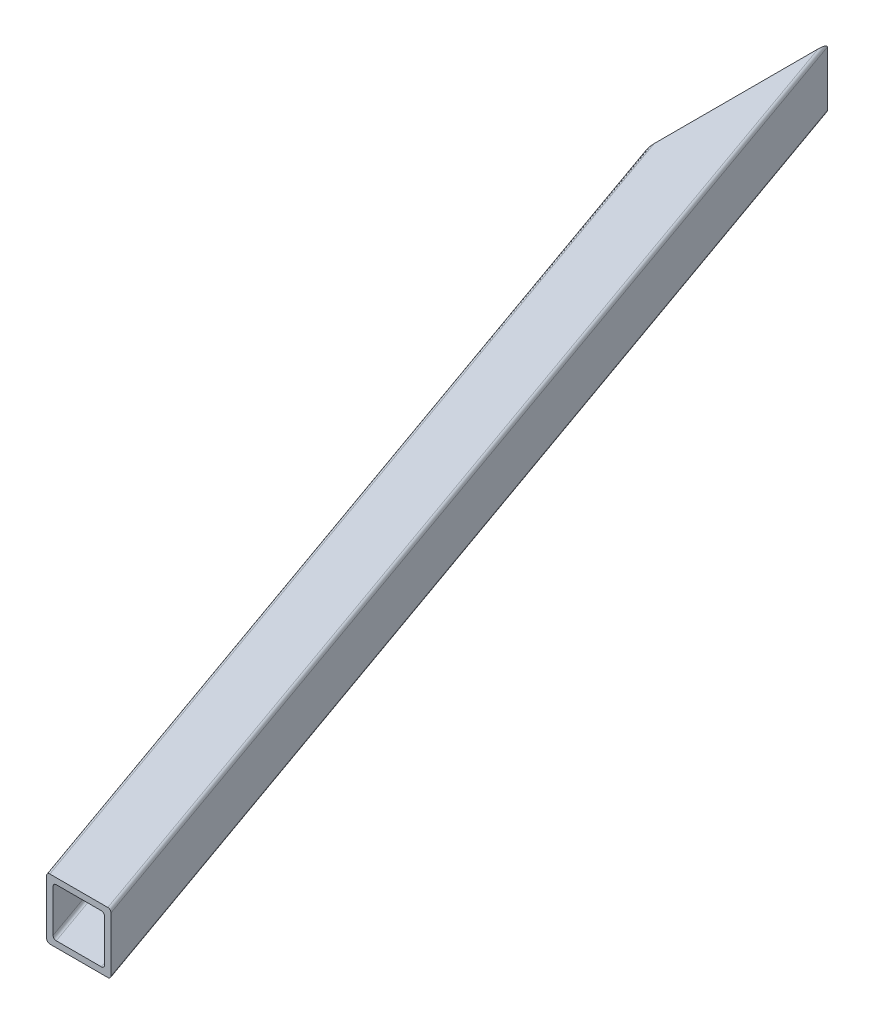
ISO-10303-21;
HEADER;
FILE_DESCRIPTION(('STEP AP214'),'2;1');
FILE_NAME('part.step','',(''),(''),'','','');
FILE_SCHEMA(('AUTOMOTIVE_DESIGN { 1 0 10303 214 1 1 1 1 }'));
ENDSEC;
DATA;
#1=APPLICATION_CONTEXT('core data for automotive mechanical design processes');
#2=APPLICATION_PROTOCOL_DEFINITION('international standard','automotive_design',2000,#1);
#3=PRODUCT_CONTEXT('',#1,'mechanical');
#4=PRODUCT('Part','Part','',(#3));
#5=PRODUCT_RELATED_PRODUCT_CATEGORY('part','',(#4));
#6=PRODUCT_DEFINITION_FORMATION('','',#4);
#7=PRODUCT_DEFINITION_CONTEXT('part definition',#1,'design');
#8=PRODUCT_DEFINITION('design','',#6,#7);
#9=PRODUCT_DEFINITION_SHAPE('','',#8);
#10=(LENGTH_UNIT() NAMED_UNIT(*) SI_UNIT(.MILLI.,.METRE.));
#11=(NAMED_UNIT(*) PLANE_ANGLE_UNIT() SI_UNIT($,.RADIAN.));
#12=(NAMED_UNIT(*) SI_UNIT($,.STERADIAN.) SOLID_ANGLE_UNIT());
#13=UNCERTAINTY_MEASURE_WITH_UNIT(LENGTH_MEASURE(1.E-05),#10,'distance_accuracy_value','');
#14=(GEOMETRIC_REPRESENTATION_CONTEXT(3) GLOBAL_UNCERTAINTY_ASSIGNED_CONTEXT((#13)) GLOBAL_UNIT_ASSIGNED_CONTEXT((#10,
#11,#12)) REPRESENTATION_CONTEXT('',''));
#15=CARTESIAN_POINT('',(0.,0.,0.));
#16=DIRECTION('',(0.,0.,1.));
#17=DIRECTION('',(1.,0.,0.));
#18=AXIS2_PLACEMENT_3D('',#15,#16,#17);
#19=CARTESIAN_POINT('',(0.,40.,-609.961146445834));
#20=DIRECTION('',(1.,0.,0.));
#21=DIRECTION('',(0.,0.,-1.));
#22=AXIS2_PLACEMENT_3D('',#19,#20,#21);
#23=PLANE('',#22);
#24=DIRECTION('',(0.,0.,-1.));
#25=VECTOR('',#24,1.);
#26=CARTESIAN_POINT('',(0.,4.,-609.961146445834));
#27=LINE('',#26,#25);
#28=CARTESIAN_POINT('',(0.,4.,-627.966974478959));
#29=VERTEX_POINT('',#28);
#30=CARTESIAN_POINT('',(0.,3.99999999999999,-711.994171966875));
#31=VERTEX_POINT('',#30);
#32=EDGE_CURVE('E254',#29,#31,#27,.T.);
#33=ORIENTED_EDGE('',*,*,#32,.T.);
#34=CARTESIAN_POINT('',(0.,6.,-711.994171966875));
#35=DIRECTION('',(1.,0.,0.));
#36=DIRECTION('',(0.,0.,-1.));
#37=AXIS2_PLACEMENT_3D('',#34,#35,#36);
#38=ELLIPSE('',#37,6.00194267770828,2.);
#39=CARTESIAN_POINT('',(0.,6.,-717.996114644584));
#40=VERTEX_POINT('',#39);
#41=EDGE_CURVE('E43',#31,#40,#38,.T.);
#42=ORIENTED_EDGE('',*,*,#41,.T.);
#43=DIRECTION('',(0.,1.,0.));
#44=VECTOR('',#43,1.);
#45=CARTESIAN_POINT('',(0.,40.,-717.996114644584));
#46=LINE('',#45,#44);
#47=CARTESIAN_POINT('',(0.,34.,-717.996114644584));
#48=VERTEX_POINT('',#47);
#49=EDGE_CURVE('E252',#40,#48,#46,.T.);
#50=ORIENTED_EDGE('',*,*,#49,.T.);
#51=CARTESIAN_POINT('',(0.,34.,-711.994171966875));
#52=DIRECTION('',(1.,0.,0.));
#53=DIRECTION('',(0.,0.,1.));
#54=AXIS2_PLACEMENT_3D('',#51,#52,#53);
#55=ELLIPSE('',#54,6.00194267770828,2.);
#56=CARTESIAN_POINT('',(0.,36.,-711.994171966875));
#57=VERTEX_POINT('',#56);
#58=EDGE_CURVE('E237',#48,#57,#55,.T.);
#59=ORIENTED_EDGE('',*,*,#58,.T.);
#60=DIRECTION('',(0.,0.,1.));
#61=VECTOR('',#60,1.);
#62=CARTESIAN_POINT('',(0.,36.,-609.961146445834));
#63=LINE('',#62,#61);
#64=CARTESIAN_POINT('',(0.,36.,-627.966974478959));
#65=VERTEX_POINT('',#64);
#66=EDGE_CURVE('E179',#57,#65,#63,.T.);
#67=ORIENTED_EDGE('',*,*,#66,.T.);
#68=CARTESIAN_POINT('',(0.,34.,-627.966974478959));
#69=DIRECTION('',(1.,0.,0.));
#70=DIRECTION('',(0.,0.,-1.));
#71=AXIS2_PLACEMENT_3D('',#68,#69,#70);
#72=ELLIPSE('',#71,6.00194267770827,2.);
#73=CARTESIAN_POINT('',(0.,34.,-621.965031801251));
#74=VERTEX_POINT('',#73);
#75=EDGE_CURVE('E243',#65,#74,#72,.T.);
#76=ORIENTED_EDGE('',*,*,#75,.T.);
#77=DIRECTION('',(0.,-1.,0.));
#78=VECTOR('',#77,1.);
#79=CARTESIAN_POINT('',(0.,40.,-621.965031801251));
#80=LINE('',#79,#78);
#81=CARTESIAN_POINT('',(0.,6.,-621.965031801251));
#82=VERTEX_POINT('',#81);
#83=EDGE_CURVE('E277',#74,#82,#80,.T.);
#84=ORIENTED_EDGE('',*,*,#83,.T.);
#85=CARTESIAN_POINT('',(0.,6.,-627.966974478959));
#86=DIRECTION('',(1.,0.,0.));
#87=DIRECTION('',(0.,0.,1.));
#88=AXIS2_PLACEMENT_3D('',#85,#86,#87);
#89=ELLIPSE('',#88,6.00194267770827,2.);
#90=EDGE_CURVE('E247',#82,#29,#89,.T.);
#91=ORIENTED_EDGE('',*,*,#90,.T.);
#92=EDGE_LOOP('',(#33,#42,#50,#59,#67,#76,#84,#91));
#93=FACE_BOUND('',#92,.T.);
#94=DIRECTION('',(0.,-1.,0.));
#95=VECTOR('',#94,1.);
#96=CARTESIAN_POINT('',(0.,40.,-609.961146445834));
#97=LINE('',#96,#95);
#98=CARTESIAN_POINT('',(0.,38.,-609.961146445834));
#99=VERTEX_POINT('',#98);
#100=CARTESIAN_POINT('',(0.,2.,-609.961146445834));
#101=VERTEX_POINT('',#100);
#102=EDGE_CURVE('E167',#99,#101,#97,.T.);
#103=ORIENTED_EDGE('',*,*,#102,.F.);
#104=CARTESIAN_POINT('',(0.,38.,-615.963089123543));
#105=DIRECTION('',(1.,0.,0.));
#106=DIRECTION('',(0.,0.,1.));
#107=AXIS2_PLACEMENT_3D('',#104,#105,#106);
#108=ELLIPSE('',#107,6.00194267770827,2.);
#109=CARTESIAN_POINT('',(0.,40.,-615.963089123543));
#110=VERTEX_POINT('',#109);
#111=EDGE_CURVE('E154',#99,#110,#108,.F.);
#112=ORIENTED_EDGE('',*,*,#111,.T.);
#113=DIRECTION('',(0.,0.,1.));
#114=VECTOR('',#113,1.);
#115=CARTESIAN_POINT('',(0.,40.,-609.961146445834));
#116=LINE('',#115,#114);
#117=CARTESIAN_POINT('',(0.,40.,-723.998057322292));
#118=VERTEX_POINT('',#117);
#119=EDGE_CURVE('E162',#118,#110,#116,.T.);
#120=ORIENTED_EDGE('',*,*,#119,.F.);
#121=CARTESIAN_POINT('',(0.,38.,-723.998057322292));
#122=DIRECTION('',(1.,0.,0.));
#123=DIRECTION('',(0.,0.,-1.));
#124=AXIS2_PLACEMENT_3D('',#121,#122,#123);
#125=ELLIPSE('',#124,6.00194267770828,2.);
#126=CARTESIAN_POINT('',(0.,38.,-730.));
#127=VERTEX_POINT('',#126);
#128=EDGE_CURVE('E58',#118,#127,#125,.F.);
#129=ORIENTED_EDGE('',*,*,#128,.T.);
#130=DIRECTION('',(0.,-1.,0.));
#131=VECTOR('',#130,1.);
#132=CARTESIAN_POINT('',(0.,40.,-730.));
#133=LINE('',#132,#131);
#134=CARTESIAN_POINT('',(0.,2.,-730.));
#135=VERTEX_POINT('',#134);
#136=EDGE_CURVE('E173',#127,#135,#133,.T.);
#137=ORIENTED_EDGE('',*,*,#136,.T.);
#138=CARTESIAN_POINT('',(0.,2.,-723.998057322292));
#139=DIRECTION('',(1.,0.,0.));
#140=DIRECTION('',(0.,0.,1.));
#141=AXIS2_PLACEMENT_3D('',#138,#139,#140);
#142=ELLIPSE('',#141,6.00194267770828,2.);
#143=CARTESIAN_POINT('',(0.,0.,-723.998057322292));
#144=VERTEX_POINT('',#143);
#145=EDGE_CURVE('E50',#135,#144,#142,.F.);
#146=ORIENTED_EDGE('',*,*,#145,.T.);
#147=DIRECTION('',(0.,0.,1.));
#148=VECTOR('',#147,1.);
#149=CARTESIAN_POINT('',(0.,0.,-609.961146445834));
#150=LINE('',#149,#148);
#151=CARTESIAN_POINT('',(0.,0.,-615.963089123543));
#152=VERTEX_POINT('',#151);
#153=EDGE_CURVE('E176',#144,#152,#150,.T.);
#154=ORIENTED_EDGE('',*,*,#153,.T.);
#155=CARTESIAN_POINT('',(0.,2.,-615.963089123543));
#156=DIRECTION('',(1.,0.,0.));
#157=DIRECTION('',(0.,0.,-1.));
#158=AXIS2_PLACEMENT_3D('',#155,#156,#157);
#159=ELLIPSE('',#158,6.00194267770827,2.);
#160=EDGE_CURVE('E155',#152,#101,#159,.F.);
#161=ORIENTED_EDGE('',*,*,#160,.T.);
#162=EDGE_LOOP('',(#103,#112,#120,#129,#137,#146,#154,#161));
#163=FACE_BOUND('',#162,.T.);
#164=ADVANCED_FACE('F35',(#93,#163),#23,.F.);
#165=CARTESIAN_POINT('',(0.,40.,-609.961146445834));
#166=DIRECTION('',(0.942847180080519,0.,-0.333225441727088));
#167=DIRECTION('',(-0.333225441727088,0.,-0.942847180080519));
#168=AXIS2_PLACEMENT_3D('',#165,#166,#167);
#169=PLANE('',#168);
#170=DIRECTION('',(0.,-1.,0.));
#171=VECTOR('',#170,1.);
#172=CARTESIAN_POINT('',(215.575309291816,40.,0.));
#173=LINE('',#172,#171);
#174=CARTESIAN_POINT('',(215.575309291816,38.,0.));
#175=VERTEX_POINT('',#174);
#176=CARTESIAN_POINT('',(215.575309291816,2.,0.));
#177=VERTEX_POINT('',#176);
#178=EDGE_CURVE('E188',#175,#177,#173,.T.);
#179=ORIENTED_EDGE('',*,*,#178,.F.);
#180=DIRECTION('',(0.333225441727088,0.,0.942847180080519));
#181=VECTOR('',#180,1.);
#182=CARTESIAN_POINT('',(0.,38.,-609.961146445834));
#183=LINE('',#182,#181);
#184=EDGE_CURVE('E205',#175,#99,#183,.F.);
#185=ORIENTED_EDGE('',*,*,#184,.T.);
#186=ORIENTED_EDGE('',*,*,#102,.T.);
#187=DIRECTION('',(0.333225441727088,0.,0.942847180080519));
#188=VECTOR('',#187,1.);
#189=CARTESIAN_POINT('',(215.575309291816,2.,0.));
#190=LINE('',#189,#188);
#191=EDGE_CURVE('E202',#101,#177,#190,.T.);
#192=ORIENTED_EDGE('',*,*,#191,.T.);
#193=EDGE_LOOP('',(#179,#185,#186,#192));
#194=FACE_BOUND('',#193,.T.);
#195=ADVANCED_FACE('F316',(#194),#169,.F.);
#196=CARTESIAN_POINT('',(215.575309291816,40.,0.));
#197=DIRECTION('',(0.,0.,-1.));
#198=DIRECTION('',(-1.,0.,0.));
#199=AXIS2_PLACEMENT_3D('',#196,#197,#198);
#200=PLANE('',#199);
#201=DIRECTION('',(-1.,0.,0.));
#202=VECTOR('',#201,1.);
#203=CARTESIAN_POINT('',(215.575309291816,4.,0.));
#204=LINE('',#203,#202);
#205=CARTESIAN_POINT('',(251.636296393772,3.99999999999999,0.));
#206=VERTEX_POINT('',#205);
#207=CARTESIAN_POINT('',(221.939012898043,4.,0.));
#208=VERTEX_POINT('',#207);
#209=EDGE_CURVE('E273',#206,#208,#204,.T.);
#210=ORIENTED_EDGE('',*,*,#209,.T.);
#211=CARTESIAN_POINT('',(221.939012898043,6.,0.));
#212=DIRECTION('',(0.,0.,-1.));
#213=DIRECTION('',(1.,0.,0.));
#214=AXIS2_PLACEMENT_3D('',#211,#212,#213);
#215=ELLIPSE('',#214,2.12123453540923,2.);
#216=CARTESIAN_POINT('',(219.817778362634,6.,0.));
#217=VERTEX_POINT('',#216);
#218=EDGE_CURVE('E245',#208,#217,#215,.T.);
#219=ORIENTED_EDGE('',*,*,#218,.T.);
#220=DIRECTION('',(0.,1.,0.));
#221=VECTOR('',#220,1.);
#222=CARTESIAN_POINT('',(219.817778362634,40.,0.));
#223=LINE('',#222,#221);
#224=CARTESIAN_POINT('',(219.817778362634,34.,0.));
#225=VERTEX_POINT('',#224);
#226=EDGE_CURVE('E263',#217,#225,#223,.T.);
#227=ORIENTED_EDGE('',*,*,#226,.T.);
#228=CARTESIAN_POINT('',(221.939012898043,34.,0.));
#229=DIRECTION('',(0.,0.,-1.));
#230=DIRECTION('',(-1.,0.,0.));
#231=AXIS2_PLACEMENT_3D('',#228,#229,#230);
#232=ELLIPSE('',#231,2.12123453540923,2.);
#233=CARTESIAN_POINT('',(221.939012898043,36.,0.));
#234=VERTEX_POINT('',#233);
#235=EDGE_CURVE('E241',#225,#234,#232,.T.);
#236=ORIENTED_EDGE('',*,*,#235,.T.);
#237=DIRECTION('',(1.,0.,0.));
#238=VECTOR('',#237,1.);
#239=CARTESIAN_POINT('',(215.575309291816,36.,0.));
#240=LINE('',#239,#238);
#241=CARTESIAN_POINT('',(251.636296393772,36.,0.));
#242=VERTEX_POINT('',#241);
#243=EDGE_CURVE('E279',#234,#242,#240,.T.);
#244=ORIENTED_EDGE('',*,*,#243,.T.);
#245=CARTESIAN_POINT('',(251.636296393772,34.,0.));
#246=DIRECTION('',(0.,0.,-1.));
#247=DIRECTION('',(1.,0.,0.));
#248=AXIS2_PLACEMENT_3D('',#245,#246,#247);
#249=ELLIPSE('',#248,2.12123453540923,2.);
#250=CARTESIAN_POINT('',(253.757530929182,34.,0.));
#251=VERTEX_POINT('',#250);
#252=EDGE_CURVE('E239',#242,#251,#249,.T.);
#253=ORIENTED_EDGE('',*,*,#252,.T.);
#254=DIRECTION('',(0.,-1.,0.));
#255=VECTOR('',#254,1.);
#256=CARTESIAN_POINT('',(253.757530929182,40.,0.));
#257=LINE('',#256,#255);
#258=CARTESIAN_POINT('',(253.757530929182,6.,0.));
#259=VERTEX_POINT('',#258);
#260=EDGE_CURVE('E264',#251,#259,#257,.T.);
#261=ORIENTED_EDGE('',*,*,#260,.T.);
#262=CARTESIAN_POINT('',(251.636296393772,6.,0.));
#263=DIRECTION('',(0.,0.,-1.));
#264=DIRECTION('',(-1.,0.,0.));
#265=AXIS2_PLACEMENT_3D('',#262,#263,#264);
#266=ELLIPSE('',#265,2.12123453540923,2.);
#267=EDGE_CURVE('E11',#259,#206,#266,.T.);
#268=ORIENTED_EDGE('',*,*,#267,.T.);
#269=EDGE_LOOP('',(#210,#219,#227,#236,#244,#253,#261,#268));
#270=FACE_BOUND('',#269,.T.);
#271=DIRECTION('',(1.,0.,0.));
#272=VECTOR('',#271,1.);
#273=CARTESIAN_POINT('',(215.575309291816,40.,0.));
#274=LINE('',#273,#272);
#275=CARTESIAN_POINT('',(217.696543827225,40.,0.));
#276=VERTEX_POINT('',#275);
#277=CARTESIAN_POINT('',(255.878765464591,40.,0.));
#278=VERTEX_POINT('',#277);
#279=EDGE_CURVE('E165',#276,#278,#274,.T.);
#280=ORIENTED_EDGE('',*,*,#279,.F.);
#281=CARTESIAN_POINT('',(217.696543827225,38.,0.));
#282=DIRECTION('',(0.,0.,-1.));
#283=DIRECTION('',(1.,0.,0.));
#284=AXIS2_PLACEMENT_3D('',#281,#282,#283);
#285=ELLIPSE('',#284,2.12123453540923,2.);
#286=EDGE_CURVE('E200',#276,#175,#285,.F.);
#287=ORIENTED_EDGE('',*,*,#286,.T.);
#288=ORIENTED_EDGE('',*,*,#178,.T.);
#289=CARTESIAN_POINT('',(217.696543827225,2.,0.));
#290=DIRECTION('',(0.,0.,-1.));
#291=DIRECTION('',(-1.,0.,0.));
#292=AXIS2_PLACEMENT_3D('',#289,#290,#291);
#293=ELLIPSE('',#292,2.12123453540923,2.);
#294=CARTESIAN_POINT('',(217.696543827225,0.,0.));
#295=VERTEX_POINT('',#294);
#296=EDGE_CURVE('E196',#177,#295,#293,.F.);
#297=ORIENTED_EDGE('',*,*,#296,.T.);
#298=DIRECTION('',(1.,0.,0.));
#299=VECTOR('',#298,1.);
#300=CARTESIAN_POINT('',(215.575309291816,0.,0.));
#301=LINE('',#300,#299);
#302=CARTESIAN_POINT('',(255.878765464591,0.,0.));
#303=VERTEX_POINT('',#302);
#304=EDGE_CURVE('E171',#295,#303,#301,.T.);
#305=ORIENTED_EDGE('',*,*,#304,.T.);
#306=CARTESIAN_POINT('',(255.878765464591,2.,0.));
#307=DIRECTION('',(0.,0.,-1.));
#308=DIRECTION('',(1.,0.,0.));
#309=AXIS2_PLACEMENT_3D('',#306,#307,#308);
#310=ELLIPSE('',#309,2.12123453540923,2.);
#311=CARTESIAN_POINT('',(258.,2.,0.));
#312=VERTEX_POINT('',#311);
#313=EDGE_CURVE('E194',#303,#312,#310,.F.);
#314=ORIENTED_EDGE('',*,*,#313,.T.);
#315=DIRECTION('',(0.,-1.,0.));
#316=VECTOR('',#315,1.);
#317=CARTESIAN_POINT('',(258.,40.,0.));
#318=LINE('',#317,#316);
#319=CARTESIAN_POINT('',(258.,38.,0.));
#320=VERTEX_POINT('',#319);
#321=EDGE_CURVE('E185',#320,#312,#318,.T.);
#322=ORIENTED_EDGE('',*,*,#321,.F.);
#323=CARTESIAN_POINT('',(255.878765464591,38.,0.));
#324=DIRECTION('',(0.,0.,-1.));
#325=DIRECTION('',(-1.,0.,0.));
#326=AXIS2_PLACEMENT_3D('',#323,#324,#325);
#327=ELLIPSE('',#326,2.12123453540923,2.);
#328=EDGE_CURVE('E198',#320,#278,#327,.F.);
#329=ORIENTED_EDGE('',*,*,#328,.T.);
#330=EDGE_LOOP('',(#280,#287,#288,#297,#305,#314,#322,#329));
#331=FACE_BOUND('',#330,.T.);
#332=ADVANCED_FACE('F271',(#270,#331),#200,.F.);
#333=CARTESIAN_POINT('',(258.,40.,0.));
#334=DIRECTION('',(-0.942847180080519,0.,0.333225441727088));
#335=DIRECTION('',(0.333225441727088,0.,0.942847180080519));
#336=AXIS2_PLACEMENT_3D('',#333,#334,#335);
#337=PLANE('',#336);
#338=ORIENTED_EDGE('',*,*,#136,.F.);
#339=DIRECTION('',(-0.333225441727088,0.,-0.942847180080519));
#340=VECTOR('',#339,1.);
#341=CARTESIAN_POINT('',(258.,38.,0.));
#342=LINE('',#341,#340);
#343=EDGE_CURVE('E153',#127,#320,#342,.F.);
#344=ORIENTED_EDGE('',*,*,#343,.T.);
#345=ORIENTED_EDGE('',*,*,#321,.T.);
#346=DIRECTION('',(-0.333225441727088,0.,-0.942847180080519));
#347=VECTOR('',#346,1.);
#348=CARTESIAN_POINT('',(0.,2.,-730.));
#349=LINE('',#348,#347);
#350=EDGE_CURVE('E230',#312,#135,#349,.T.);
#351=ORIENTED_EDGE('',*,*,#350,.T.);
#352=EDGE_LOOP('',(#338,#344,#345,#351));
#353=FACE_BOUND('',#352,.T.);
#354=ADVANCED_FACE('F391',(#353),#337,.F.);
#355=CARTESIAN_POINT('',(0.,40.,0.));
#356=DIRECTION('',(0.,-1.,0.));
#357=DIRECTION('',(0.,0.,-1.));
#358=AXIS2_PLACEMENT_3D('',#355,#356,#357);
#359=PLANE('',#358);
#360=ORIENTED_EDGE('',*,*,#119,.T.);
#361=DIRECTION('',(0.333225441727088,0.,0.942847180080519));
#362=VECTOR('',#361,1.);
#363=CARTESIAN_POINT('',(193.523694843273,40.,-68.396045574746));
#364=LINE('',#363,#362);
#365=EDGE_CURVE('E166',#110,#276,#364,.T.);
#366=ORIENTED_EDGE('',*,*,#365,.T.);
#367=ORIENTED_EDGE('',*,*,#279,.T.);
#368=DIRECTION('',(-0.333225441727088,0.,-0.942847180080519));
#369=VECTOR('',#368,1.);
#370=CARTESIAN_POINT('',(227.466193326172,40.,-80.3921614769211));
#371=LINE('',#370,#369);
#372=EDGE_CURVE('E152',#278,#118,#371,.T.);
#373=ORIENTED_EDGE('',*,*,#372,.T.);
#374=EDGE_LOOP('',(#360,#366,#367,#373));
#375=FACE_BOUND('',#374,.T.);
#376=ADVANCED_FACE('F160',(#375),#359,.F.);
#377=CARTESIAN_POINT('',(0.,0.,0.));
#378=DIRECTION('',(0.,-1.,0.));
#379=DIRECTION('',(0.,0.,-1.));
#380=AXIS2_PLACEMENT_3D('',#377,#378,#379);
#381=PLANE('',#380);
#382=ORIENTED_EDGE('',*,*,#304,.F.);
#383=DIRECTION('',(0.333225441727088,0.,0.942847180080519));
#384=VECTOR('',#383,1.);
#385=CARTESIAN_POINT('',(1.88569436016104,0.,-610.627597329289));
#386=LINE('',#385,#384);
#387=EDGE_CURVE('E235',#295,#152,#386,.F.);
#388=ORIENTED_EDGE('',*,*,#387,.T.);
#389=ORIENTED_EDGE('',*,*,#153,.F.);
#390=DIRECTION('',(-0.333225441727088,0.,-0.942847180080519));
#391=VECTOR('',#390,1.);
#392=CARTESIAN_POINT('',(256.114305639839,0.,0.666450883454182));
#393=LINE('',#392,#391);
#394=EDGE_CURVE('E233',#144,#303,#393,.F.);
#395=ORIENTED_EDGE('',*,*,#394,.T.);
#396=EDGE_LOOP('',(#382,#388,#389,#395));
#397=FACE_BOUND('',#396,.T.);
#398=ADVANCED_FACE('F327',(#397),#381,.T.);
#399=CARTESIAN_POINT('',(3.77138872032208,40.,-611.294048212743));
#400=DIRECTION('',(0.942847180080519,0.,-0.333225441727088));
#401=DIRECTION('',(-0.333225441727088,0.,-0.942847180080519));
#402=AXIS2_PLACEMENT_3D('',#399,#400,#401);
#403=PLANE('',#402);
#404=ORIENTED_EDGE('',*,*,#83,.F.);
#405=DIRECTION('',(0.333225441727088,0.,0.942847180080519));
#406=VECTOR('',#405,1.);
#407=CARTESIAN_POINT('',(219.817778362634,34.,1.220058898834E-13));
#408=LINE('',#407,#406);
#409=EDGE_CURVE('E221',#74,#225,#408,.T.);
#410=ORIENTED_EDGE('',*,*,#409,.T.);
#411=ORIENTED_EDGE('',*,*,#226,.F.);
#412=DIRECTION('',(0.333225441727088,0.,0.942847180080519));
#413=VECTOR('',#412,1.);
#414=CARTESIAN_POINT('',(3.77138872032208,6.,-611.294048212743));
#415=LINE('',#414,#413);
#416=EDGE_CURVE('E219',#217,#82,#415,.F.);
#417=ORIENTED_EDGE('',*,*,#416,.T.);
#418=EDGE_LOOP('',(#404,#410,#411,#417));
#419=FACE_BOUND('',#418,.T.);
#420=ADVANCED_FACE('F300',(#419),#403,.T.);
#421=CARTESIAN_POINT('',(254.228611279678,40.,1.33290176690835));
#422=DIRECTION('',(-0.942847180080519,0.,0.333225441727088));
#423=DIRECTION('',(0.333225441727088,0.,0.942847180080519));
#424=AXIS2_PLACEMENT_3D('',#421,#422,#423);
#425=PLANE('',#424);
#426=ORIENTED_EDGE('',*,*,#260,.F.);
#427=DIRECTION('',(-0.333225441727088,0.,-0.942847180080519));
#428=VECTOR('',#427,1.);
#429=CARTESIAN_POINT('',(0.,34.,-717.996114644583));
#430=LINE('',#429,#428);
#431=EDGE_CURVE('E212',#251,#48,#430,.T.);
#432=ORIENTED_EDGE('',*,*,#431,.T.);
#433=ORIENTED_EDGE('',*,*,#49,.F.);
#434=DIRECTION('',(-0.333225441727088,0.,-0.942847180080519));
#435=VECTOR('',#434,1.);
#436=CARTESIAN_POINT('',(254.228611279678,6.,1.33290176690835));
#437=LINE('',#436,#435);
#438=EDGE_CURVE('E210',#40,#259,#437,.F.);
#439=ORIENTED_EDGE('',*,*,#438,.T.);
#440=EDGE_LOOP('',(#426,#432,#433,#439));
#441=FACE_BOUND('',#440,.T.);
#442=ADVANCED_FACE('F260',(#441),#425,.T.);
#443=CARTESIAN_POINT('',(0.,36.,0.));
#444=DIRECTION('',(0.,-1.,0.));
#445=DIRECTION('',(0.,0.,-1.));
#446=AXIS2_PLACEMENT_3D('',#443,#444,#445);
#447=PLANE('',#446);
#448=ORIENTED_EDGE('',*,*,#66,.F.);
#449=DIRECTION('',(-0.333225441727088,0.,-0.942847180080519));
#450=VECTOR('',#449,1.);
#451=CARTESIAN_POINT('',(251.871836569021,36.,0.666450883454219));
#452=LINE('',#451,#450);
#453=EDGE_CURVE('E217',#57,#242,#452,.F.);
#454=ORIENTED_EDGE('',*,*,#453,.T.);
#455=ORIENTED_EDGE('',*,*,#243,.F.);
#456=DIRECTION('',(0.333225441727088,0.,0.942847180080519));
#457=VECTOR('',#456,1.);
#458=CARTESIAN_POINT('',(1.88569436016102,36.,-622.631482684705));
#459=LINE('',#458,#457);
#460=EDGE_CURVE('E215',#234,#65,#459,.F.);
#461=ORIENTED_EDGE('',*,*,#460,.T.);
#462=EDGE_LOOP('',(#448,#454,#455,#461));
#463=FACE_BOUND('',#462,.T.);
#464=ADVANCED_FACE('F330',(#463),#447,.T.);
#465=CARTESIAN_POINT('',(0.,4.,0.));
#466=DIRECTION('',(0.,-1.,0.));
#467=DIRECTION('',(0.,0.,-1.));
#468=AXIS2_PLACEMENT_3D('',#465,#466,#467);
#469=PLANE('',#468);
#470=ORIENTED_EDGE('',*,*,#32,.F.);
#471=DIRECTION('',(0.333225441727088,0.,0.942847180080519));
#472=VECTOR('',#471,1.);
#473=CARTESIAN_POINT('',(197.295083563596,4.,-69.7289473416543));
#474=LINE('',#473,#472);
#475=EDGE_CURVE('E227',#29,#208,#474,.T.);
#476=ORIENTED_EDGE('',*,*,#475,.T.);
#477=ORIENTED_EDGE('',*,*,#209,.F.);
#478=DIRECTION('',(-0.333225441727088,0.,-0.942847180080519));
#479=VECTOR('',#478,1.);
#480=CARTESIAN_POINT('',(223.69480460585,4.,-79.0592597100127));
#481=LINE('',#480,#479);
#482=EDGE_CURVE('E224',#206,#31,#481,.T.);
#483=ORIENTED_EDGE('',*,*,#482,.T.);
#484=EDGE_LOOP('',(#470,#476,#477,#483));
#485=FACE_BOUND('',#484,.T.);
#486=ADVANCED_FACE('F275',(#485),#469,.F.);
#487=CARTESIAN_POINT('',(193.523694843273,38.,-68.396045574746));
#488=DIRECTION('',(0.333225441727088,0.,0.942847180080519));
#489=DIRECTION('',(0.942847180080519,0.,-0.333225441727088));
#490=AXIS2_PLACEMENT_3D('',#487,#488,#489);
#491=CYLINDRICAL_SURFACE('',#490,2.);
#492=ORIENTED_EDGE('',*,*,#111,.F.);
#493=ORIENTED_EDGE('',*,*,#184,.F.);
#494=ORIENTED_EDGE('',*,*,#286,.F.);
#495=ORIENTED_EDGE('',*,*,#365,.F.);
#496=EDGE_LOOP('',(#492,#493,#494,#495));
#497=FACE_BOUND('',#496,.T.);
#498=ADVANCED_FACE('F335',(#497),#491,.T.);
#499=CARTESIAN_POINT('',(252.342916919517,34.,1.99935265036253));
#500=DIRECTION('',(0.333225441727088,0.,0.942847180080519));
#501=DIRECTION('',(0.942847180080519,0.,-0.333225441727088));
#502=AXIS2_PLACEMENT_3D('',#499,#500,#501);
#503=CYLINDRICAL_SURFACE('',#502,2.);
#504=ORIENTED_EDGE('',*,*,#252,.F.);
#505=ORIENTED_EDGE('',*,*,#453,.F.);
#506=ORIENTED_EDGE('',*,*,#58,.F.);
#507=ORIENTED_EDGE('',*,*,#431,.F.);
#508=EDGE_LOOP('',(#504,#505,#506,#507));
#509=FACE_BOUND('',#508,.T.);
#510=ADVANCED_FACE('F313',(#509),#503,.F.);
#511=CARTESIAN_POINT('',(5.65708308048312,34.,-611.960499096197));
#512=DIRECTION('',(-0.333225441727088,0.,-0.942847180080519));
#513=DIRECTION('',(-0.942847180080519,0.,0.333225441727088));
#514=AXIS2_PLACEMENT_3D('',#511,#512,#513);
#515=CYLINDRICAL_SURFACE('',#514,2.);
#516=ORIENTED_EDGE('',*,*,#75,.F.);
#517=ORIENTED_EDGE('',*,*,#460,.F.);
#518=ORIENTED_EDGE('',*,*,#235,.F.);
#519=ORIENTED_EDGE('',*,*,#409,.F.);
#520=EDGE_LOOP('',(#516,#517,#518,#519));
#521=FACE_BOUND('',#520,.T.);
#522=ADVANCED_FACE('F296',(#521),#515,.F.);
#523=CARTESIAN_POINT('',(197.295083563596,6.,-69.7289473416543));
#524=DIRECTION('',(0.333225441727088,0.,0.942847180080519));
#525=DIRECTION('',(0.942847180080519,0.,-0.333225441727088));
#526=AXIS2_PLACEMENT_3D('',#523,#524,#525);
#527=CYLINDRICAL_SURFACE('',#526,2.);
#528=ORIENTED_EDGE('',*,*,#90,.F.);
#529=ORIENTED_EDGE('',*,*,#416,.F.);
#530=ORIENTED_EDGE('',*,*,#218,.F.);
#531=ORIENTED_EDGE('',*,*,#475,.F.);
#532=EDGE_LOOP('',(#528,#529,#530,#531));
#533=FACE_BOUND('',#532,.T.);
#534=ADVANCED_FACE('F305',(#533),#527,.F.);
#535=CARTESIAN_POINT('',(223.69480460585,6.,-79.0592597100128));
#536=DIRECTION('',(-0.333225441727088,0.,-0.942847180080519));
#537=DIRECTION('',(-0.942847180080519,0.,0.333225441727088));
#538=AXIS2_PLACEMENT_3D('',#535,#536,#537);
#539=CYLINDRICAL_SURFACE('',#538,2.);
#540=ORIENTED_EDGE('',*,*,#267,.F.);
#541=ORIENTED_EDGE('',*,*,#438,.F.);
#542=ORIENTED_EDGE('',*,*,#41,.F.);
#543=ORIENTED_EDGE('',*,*,#482,.F.);
#544=EDGE_LOOP('',(#540,#541,#542,#543));
#545=FACE_BOUND('',#544,.T.);
#546=ADVANCED_FACE('F267',(#545),#539,.F.);
#547=CARTESIAN_POINT('',(227.466193326172,38.,-80.3921614769211));
#548=DIRECTION('',(-0.333225441727088,0.,-0.942847180080519));
#549=DIRECTION('',(-0.942847180080519,0.,0.333225441727088));
#550=AXIS2_PLACEMENT_3D('',#547,#548,#549);
#551=CYLINDRICAL_SURFACE('',#550,2.);
#552=ORIENTED_EDGE('',*,*,#328,.F.);
#553=ORIENTED_EDGE('',*,*,#343,.F.);
#554=ORIENTED_EDGE('',*,*,#128,.F.);
#555=ORIENTED_EDGE('',*,*,#372,.F.);
#556=EDGE_LOOP('',(#552,#553,#554,#555));
#557=FACE_BOUND('',#556,.T.);
#558=ADVANCED_FACE('F151',(#557),#551,.T.);
#559=CARTESIAN_POINT('',(1.88569436016104,2.,-610.627597329289));
#560=DIRECTION('',(-0.333225441727088,0.,-0.942847180080519));
#561=DIRECTION('',(-0.942847180080519,0.,0.333225441727088));
#562=AXIS2_PLACEMENT_3D('',#559,#560,#561);
#563=CYLINDRICAL_SURFACE('',#562,2.);
#564=ORIENTED_EDGE('',*,*,#160,.F.);
#565=ORIENTED_EDGE('',*,*,#387,.F.);
#566=ORIENTED_EDGE('',*,*,#296,.F.);
#567=ORIENTED_EDGE('',*,*,#191,.F.);
#568=EDGE_LOOP('',(#564,#565,#566,#567));
#569=FACE_BOUND('',#568,.T.);
#570=ADVANCED_FACE('F368',(#569),#563,.T.);
#571=CARTESIAN_POINT('',(256.114305639839,2.,0.666450883454175));
#572=DIRECTION('',(0.333225441727088,0.,0.942847180080519));
#573=DIRECTION('',(0.942847180080519,0.,-0.333225441727088));
#574=AXIS2_PLACEMENT_3D('',#571,#572,#573);
#575=CYLINDRICAL_SURFACE('',#574,2.);
#576=ORIENTED_EDGE('',*,*,#313,.F.);
#577=ORIENTED_EDGE('',*,*,#394,.F.);
#578=ORIENTED_EDGE('',*,*,#145,.F.);
#579=ORIENTED_EDGE('',*,*,#350,.F.);
#580=EDGE_LOOP('',(#576,#577,#578,#579));
#581=FACE_BOUND('',#580,.T.);
#582=ADVANCED_FACE('F37',(#581),#575,.T.);
#583=CLOSED_SHELL('',(#164,#195,#332,#354,#376,#398,#420,#442,#464,#486,#498,#510,#522,#534,
#546,#558,#570,#582));
#584=MANIFOLD_SOLID_BREP('B2',#583);
#585=ADVANCED_BREP_SHAPE_REPRESENTATION('',(#18,#584),#14);
#586=SHAPE_DEFINITION_REPRESENTATION(#9,#585);
ENDSEC;
END-ISO-10303-21;
